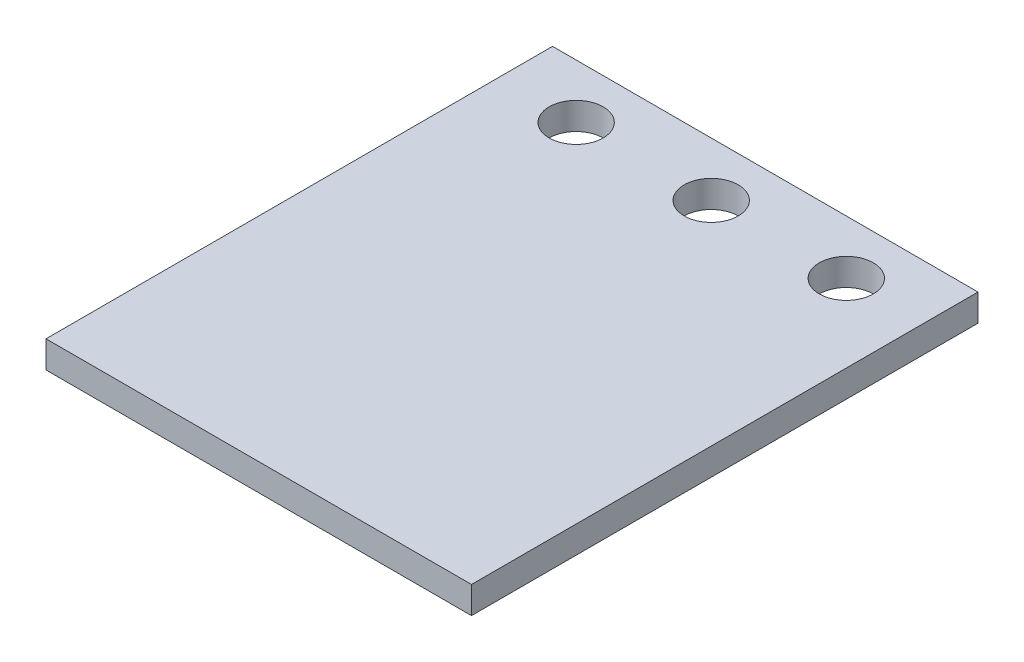
ISO-10303-21;
HEADER;
FILE_DESCRIPTION(('STEP AP214'),'2;1');
FILE_NAME('part.step','',(''),(''),'','','');
FILE_SCHEMA(('AUTOMOTIVE_DESIGN { 1 0 10303 214 1 1 1 1 }'));
ENDSEC;
DATA;
#1=APPLICATION_CONTEXT('core data for automotive mechanical design processes');
#2=APPLICATION_PROTOCOL_DEFINITION('international standard','automotive_design',2000,#1);
#3=PRODUCT_CONTEXT('',#1,'mechanical');
#4=PRODUCT('Part','Part','',(#3));
#5=PRODUCT_RELATED_PRODUCT_CATEGORY('part','',(#4));
#6=PRODUCT_DEFINITION_FORMATION('','',#4);
#7=PRODUCT_DEFINITION_CONTEXT('part definition',#1,'design');
#8=PRODUCT_DEFINITION('design','',#6,#7);
#9=PRODUCT_DEFINITION_SHAPE('','',#8);
#10=(LENGTH_UNIT() NAMED_UNIT(*) SI_UNIT(.MILLI.,.METRE.));
#11=(NAMED_UNIT(*) PLANE_ANGLE_UNIT() SI_UNIT($,.RADIAN.));
#12=(NAMED_UNIT(*) SI_UNIT($,.STERADIAN.) SOLID_ANGLE_UNIT());
#13=UNCERTAINTY_MEASURE_WITH_UNIT(LENGTH_MEASURE(1.E-05),#10,'distance_accuracy_value','');
#14=(GEOMETRIC_REPRESENTATION_CONTEXT(3) GLOBAL_UNCERTAINTY_ASSIGNED_CONTEXT((#13)) GLOBAL_UNIT_ASSIGNED_CONTEXT((#10,
#11,#12)) REPRESENTATION_CONTEXT('',''));
#15=CARTESIAN_POINT('',(0.,0.,0.));
#16=DIRECTION('',(0.,0.,1.));
#17=DIRECTION('',(1.,0.,0.));
#18=AXIS2_PLACEMENT_3D('',#15,#16,#17);
#19=CARTESIAN_POINT('',(-165.254092983453,202.834413861943,-14.9999999999997));
#20=DIRECTION('',(1.,0.,0.));
#21=DIRECTION('',(0.,0.,-1.));
#22=AXIS2_PLACEMENT_3D('',#19,#20,#21);
#23=PLANE('',#22);
#24=DIRECTION('',(0.,1.,0.));
#25=VECTOR('',#24,1.);
#26=CARTESIAN_POINT('',(-165.254092983453,202.834413861943,360.));
#27=LINE('',#26,#25);
#28=CARTESIAN_POINT('',(-165.254092983453,182.834413861943,360.));
#29=VERTEX_POINT('',#28);
#30=CARTESIAN_POINT('',(-165.254092983453,202.834413861943,360.));
#31=VERTEX_POINT('',#30);
#32=EDGE_CURVE('E96',#29,#31,#27,.T.);
#33=ORIENTED_EDGE('',*,*,#32,.T.);
#34=DIRECTION('',(0.,0.,1.));
#35=VECTOR('',#34,1.);
#36=CARTESIAN_POINT('',(-165.254092983453,202.834413861943,-14.9999999999997));
#37=LINE('',#36,#35);
#38=CARTESIAN_POINT('',(-165.254092983453,202.834413861943,-14.9999999999997));
#39=VERTEX_POINT('',#38);
#40=EDGE_CURVE('E11',#39,#31,#37,.T.);
#41=ORIENTED_EDGE('',*,*,#40,.F.);
#42=DIRECTION('',(0.,1.,0.));
#43=VECTOR('',#42,1.);
#44=CARTESIAN_POINT('',(-165.254092983453,202.834413861943,-14.9999999999997));
#45=LINE('',#44,#43);
#46=CARTESIAN_POINT('',(-165.254092983453,182.834413861943,-14.9999999999997));
#47=VERTEX_POINT('',#46);
#48=EDGE_CURVE('E84',#47,#39,#45,.T.);
#49=ORIENTED_EDGE('',*,*,#48,.F.);
#50=DIRECTION('',(0.,0.,1.));
#51=VECTOR('',#50,1.);
#52=CARTESIAN_POINT('',(-165.254092983453,182.834413861943,-14.9999999999997));
#53=LINE('',#52,#51);
#54=EDGE_CURVE('E92',#47,#29,#53,.T.);
#55=ORIENTED_EDGE('',*,*,#54,.T.);
#56=EDGE_LOOP('',(#33,#41,#49,#55));
#57=FACE_BOUND('',#56,.T.);
#58=ADVANCED_FACE('F33',(#57),#23,.F.);
#59=CARTESIAN_POINT('',(149.745907016547,202.834413861943,-14.9999999999997));
#60=DIRECTION('',(0.,-1.,0.));
#61=DIRECTION('',(0.,0.,-1.));
#62=AXIS2_PLACEMENT_3D('',#59,#60,#61);
#63=PLANE('',#62);
#64=CARTESIAN_POINT('',(-107.754092983453,202.834413861943,25.0000000000003));
#65=DIRECTION('',(0.,1.,0.));
#66=DIRECTION('',(0.,0.,1.));
#67=AXIS2_PLACEMENT_3D('',#64,#65,#66);
#68=CIRCLE('',#67,20.);
#69=CARTESIAN_POINT('',(-107.754092983453,202.834413861943,45.0000000000003));
#70=VERTEX_POINT('',#69);
#71=EDGE_CURVE('E120',#70,#70,#68,.T.);
#72=ORIENTED_EDGE('',*,*,#71,.F.);
#73=EDGE_LOOP('',(#72));
#74=FACE_BOUND('',#73,.T.);
#75=CARTESIAN_POINT('',(-7.75409298345258,202.834413861943,25.0000000000003));
#76=DIRECTION('',(0.,1.,0.));
#77=DIRECTION('',(0.,0.,1.));
#78=AXIS2_PLACEMENT_3D('',#75,#76,#77);
#79=CIRCLE('',#78,20.);
#80=CARTESIAN_POINT('',(-7.75409298345258,202.834413861943,45.0000000000003));
#81=VERTEX_POINT('',#80);
#82=EDGE_CURVE('E113',#81,#81,#79,.T.);
#83=ORIENTED_EDGE('',*,*,#82,.F.);
#84=EDGE_LOOP('',(#83));
#85=FACE_BOUND('',#84,.T.);
#86=CARTESIAN_POINT('',(92.2459070165474,202.834413861943,25.0000000000003));
#87=DIRECTION('',(0.,1.,0.));
#88=DIRECTION('',(0.,0.,1.));
#89=AXIS2_PLACEMENT_3D('',#86,#87,#88);
#90=CIRCLE('',#89,20.);
#91=CARTESIAN_POINT('',(92.2459070165474,202.834413861943,45.0000000000003));
#92=VERTEX_POINT('',#91);
#93=EDGE_CURVE('E114',#92,#92,#90,.T.);
#94=ORIENTED_EDGE('',*,*,#93,.F.);
#95=EDGE_LOOP('',(#94));
#96=FACE_BOUND('',#95,.T.);
#97=DIRECTION('',(1.,0.,0.));
#98=VECTOR('',#97,1.);
#99=CARTESIAN_POINT('',(149.745907016547,202.834413861943,360.));
#100=LINE('',#99,#98);
#101=CARTESIAN_POINT('',(149.745907016547,202.834413861943,360.));
#102=VERTEX_POINT('',#101);
#103=EDGE_CURVE('E88',#31,#102,#100,.T.);
#104=ORIENTED_EDGE('',*,*,#103,.T.);
#105=DIRECTION('',(0.,0.,1.));
#106=VECTOR('',#105,1.);
#107=CARTESIAN_POINT('',(149.745907016547,202.834413861943,-14.9999999999997));
#108=LINE('',#107,#106);
#109=CARTESIAN_POINT('',(149.745907016547,202.834413861943,-14.9999999999997));
#110=VERTEX_POINT('',#109);
#111=EDGE_CURVE('E41',#110,#102,#108,.T.);
#112=ORIENTED_EDGE('',*,*,#111,.F.);
#113=DIRECTION('',(1.,0.,0.));
#114=VECTOR('',#113,1.);
#115=CARTESIAN_POINT('',(149.745907016547,202.834413861943,-14.9999999999997));
#116=LINE('',#115,#114);
#117=EDGE_CURVE('E79',#39,#110,#116,.T.);
#118=ORIENTED_EDGE('',*,*,#117,.F.);
#119=ORIENTED_EDGE('',*,*,#40,.T.);
#120=EDGE_LOOP('',(#104,#112,#118,#119));
#121=FACE_BOUND('',#120,.T.);
#122=ADVANCED_FACE('F87',(#74,#85,#96,#121),#63,.F.);
#123=CARTESIAN_POINT('',(149.745907016547,202.834413861943,-14.9999999999997));
#124=DIRECTION('',(-1.,0.,0.));
#125=DIRECTION('',(0.,0.,1.));
#126=AXIS2_PLACEMENT_3D('',#123,#124,#125);
#127=PLANE('',#126);
#128=DIRECTION('',(0.,-1.,0.));
#129=VECTOR('',#128,1.);
#130=CARTESIAN_POINT('',(149.745907016547,202.834413861943,360.));
#131=LINE('',#130,#129);
#132=CARTESIAN_POINT('',(149.745907016547,182.834413861943,360.));
#133=VERTEX_POINT('',#132);
#134=EDGE_CURVE('E66',#102,#133,#131,.T.);
#135=ORIENTED_EDGE('',*,*,#134,.T.);
#136=DIRECTION('',(0.,0.,1.));
#137=VECTOR('',#136,1.);
#138=CARTESIAN_POINT('',(149.745907016547,182.834413861943,-14.9999999999997));
#139=LINE('',#138,#137);
#140=CARTESIAN_POINT('',(149.745907016547,182.834413861943,-14.9999999999997));
#141=VERTEX_POINT('',#140);
#142=EDGE_CURVE('E89',#141,#133,#139,.T.);
#143=ORIENTED_EDGE('',*,*,#142,.F.);
#144=DIRECTION('',(0.,-1.,0.));
#145=VECTOR('',#144,1.);
#146=CARTESIAN_POINT('',(149.745907016547,202.834413861943,-14.9999999999997));
#147=LINE('',#146,#145);
#148=EDGE_CURVE('E82',#110,#141,#147,.T.);
#149=ORIENTED_EDGE('',*,*,#148,.F.);
#150=ORIENTED_EDGE('',*,*,#111,.T.);
#151=EDGE_LOOP('',(#135,#143,#149,#150));
#152=FACE_BOUND('',#151,.T.);
#153=ADVANCED_FACE('F90',(#152),#127,.F.);
#154=CARTESIAN_POINT('',(149.745907016547,182.834413861943,-14.9999999999997));
#155=DIRECTION('',(0.,1.,0.));
#156=DIRECTION('',(0.,0.,1.));
#157=AXIS2_PLACEMENT_3D('',#154,#155,#156);
#158=PLANE('',#157);
#159=CARTESIAN_POINT('',(-107.754092983453,182.834413861943,25.0000000000003));
#160=DIRECTION('',(0.,1.,0.));
#161=DIRECTION('',(0.,0.,1.));
#162=AXIS2_PLACEMENT_3D('',#159,#160,#161);
#163=CIRCLE('',#162,20.);
#164=CARTESIAN_POINT('',(-107.754092983453,182.834413861943,45.0000000000003));
#165=VERTEX_POINT('',#164);
#166=EDGE_CURVE('E99',#165,#165,#163,.F.);
#167=ORIENTED_EDGE('',*,*,#166,.F.);
#168=EDGE_LOOP('',(#167));
#169=FACE_BOUND('',#168,.T.);
#170=CARTESIAN_POINT('',(-7.75409298345258,182.834413861943,25.0000000000003));
#171=DIRECTION('',(0.,1.,0.));
#172=DIRECTION('',(0.,0.,1.));
#173=AXIS2_PLACEMENT_3D('',#170,#171,#172);
#174=CIRCLE('',#173,20.);
#175=CARTESIAN_POINT('',(-7.75409298345258,182.834413861943,45.0000000000003));
#176=VERTEX_POINT('',#175);
#177=EDGE_CURVE('E117',#176,#176,#174,.F.);
#178=ORIENTED_EDGE('',*,*,#177,.F.);
#179=EDGE_LOOP('',(#178));
#180=FACE_BOUND('',#179,.T.);
#181=CARTESIAN_POINT('',(92.2459070165474,182.834413861943,25.0000000000003));
#182=DIRECTION('',(0.,1.,0.));
#183=DIRECTION('',(0.,0.,1.));
#184=AXIS2_PLACEMENT_3D('',#181,#182,#183);
#185=CIRCLE('',#184,20.);
#186=CARTESIAN_POINT('',(92.2459070165474,182.834413861943,45.0000000000003));
#187=VERTEX_POINT('',#186);
#188=EDGE_CURVE('E110',#187,#187,#185,.F.);
#189=ORIENTED_EDGE('',*,*,#188,.F.);
#190=EDGE_LOOP('',(#189));
#191=FACE_BOUND('',#190,.T.);
#192=DIRECTION('',(-1.,0.,0.));
#193=VECTOR('',#192,1.);
#194=CARTESIAN_POINT('',(149.745907016547,182.834413861943,360.));
#195=LINE('',#194,#193);
#196=EDGE_CURVE('E72',#133,#29,#195,.T.);
#197=ORIENTED_EDGE('',*,*,#196,.T.);
#198=ORIENTED_EDGE('',*,*,#54,.F.);
#199=DIRECTION('',(-1.,0.,0.));
#200=VECTOR('',#199,1.);
#201=CARTESIAN_POINT('',(149.745907016547,182.834413861943,-14.9999999999997));
#202=LINE('',#201,#200);
#203=EDGE_CURVE('E49',#141,#47,#202,.T.);
#204=ORIENTED_EDGE('',*,*,#203,.F.);
#205=ORIENTED_EDGE('',*,*,#142,.T.);
#206=EDGE_LOOP('',(#197,#198,#204,#205));
#207=FACE_BOUND('',#206,.T.);
#208=ADVANCED_FACE('F104',(#169,#180,#191,#207),#158,.F.);
#209=CARTESIAN_POINT('',(0.,0.,-14.9999999999997));
#210=DIRECTION('',(0.,0.,-1.));
#211=DIRECTION('',(-1.,0.,0.));
#212=AXIS2_PLACEMENT_3D('',#209,#210,#211);
#213=PLANE('',#212);
#214=ORIENTED_EDGE('',*,*,#48,.T.);
#215=ORIENTED_EDGE('',*,*,#117,.T.);
#216=ORIENTED_EDGE('',*,*,#148,.T.);
#217=ORIENTED_EDGE('',*,*,#203,.T.);
#218=EDGE_LOOP('',(#214,#215,#216,#217));
#219=FACE_BOUND('',#218,.T.);
#220=ADVANCED_FACE('F80',(#219),#213,.T.);
#221=CARTESIAN_POINT('',(0.,0.,360.));
#222=DIRECTION('',(0.,0.,-1.));
#223=DIRECTION('',(-1.,0.,0.));
#224=AXIS2_PLACEMENT_3D('',#221,#222,#223);
#225=PLANE('',#224);
#226=ORIENTED_EDGE('',*,*,#32,.F.);
#227=ORIENTED_EDGE('',*,*,#196,.F.);
#228=ORIENTED_EDGE('',*,*,#134,.F.);
#229=ORIENTED_EDGE('',*,*,#103,.F.);
#230=EDGE_LOOP('',(#226,#227,#228,#229));
#231=FACE_BOUND('',#230,.T.);
#232=ADVANCED_FACE('F107',(#231),#225,.F.);
#233=CARTESIAN_POINT('',(92.2459070165474,182.833413861943,25.0000000000003));
#234=DIRECTION('',(0.,1.,0.));
#235=DIRECTION('',(0.,0.,1.));
#236=AXIS2_PLACEMENT_3D('',#233,#234,#235);
#237=CYLINDRICAL_SURFACE('',#236,20.);
#238=ORIENTED_EDGE('',*,*,#93,.T.);
#239=EDGE_LOOP('',(#238));
#240=FACE_BOUND('',#239,.T.);
#241=ORIENTED_EDGE('',*,*,#188,.T.);
#242=EDGE_LOOP('',(#241));
#243=FACE_BOUND('',#242,.T.);
#244=ADVANCED_FACE('F137',(#240,#243),#237,.F.);
#245=CARTESIAN_POINT('',(-7.75409298345258,182.833413861943,25.0000000000003));
#246=DIRECTION('',(0.,1.,0.));
#247=DIRECTION('',(0.,0.,1.));
#248=AXIS2_PLACEMENT_3D('',#245,#246,#247);
#249=CYLINDRICAL_SURFACE('',#248,20.);
#250=ORIENTED_EDGE('',*,*,#82,.T.);
#251=EDGE_LOOP('',(#250));
#252=FACE_BOUND('',#251,.T.);
#253=ORIENTED_EDGE('',*,*,#177,.T.);
#254=EDGE_LOOP('',(#253));
#255=FACE_BOUND('',#254,.T.);
#256=ADVANCED_FACE('F140',(#252,#255),#249,.F.);
#257=CARTESIAN_POINT('',(-107.754092983453,182.833413861943,25.0000000000003));
#258=DIRECTION('',(0.,1.,0.));
#259=DIRECTION('',(0.,0.,1.));
#260=AXIS2_PLACEMENT_3D('',#257,#258,#259);
#261=CYLINDRICAL_SURFACE('',#260,20.);
#262=ORIENTED_EDGE('',*,*,#71,.T.);
#263=EDGE_LOOP('',(#262));
#264=FACE_BOUND('',#263,.T.);
#265=ORIENTED_EDGE('',*,*,#166,.T.);
#266=EDGE_LOOP('',(#265));
#267=FACE_BOUND('',#266,.T.);
#268=ADVANCED_FACE('F128',(#264,#267),#261,.F.);
#269=CLOSED_SHELL('',(#58,#122,#153,#208,#220,#232,#244,#256,#268));
#270=MANIFOLD_SOLID_BREP('B2',#269);
#271=ADVANCED_BREP_SHAPE_REPRESENTATION('',(#18,#270),#14);
#272=SHAPE_DEFINITION_REPRESENTATION(#9,#271);
ENDSEC;
END-ISO-10303-21;
